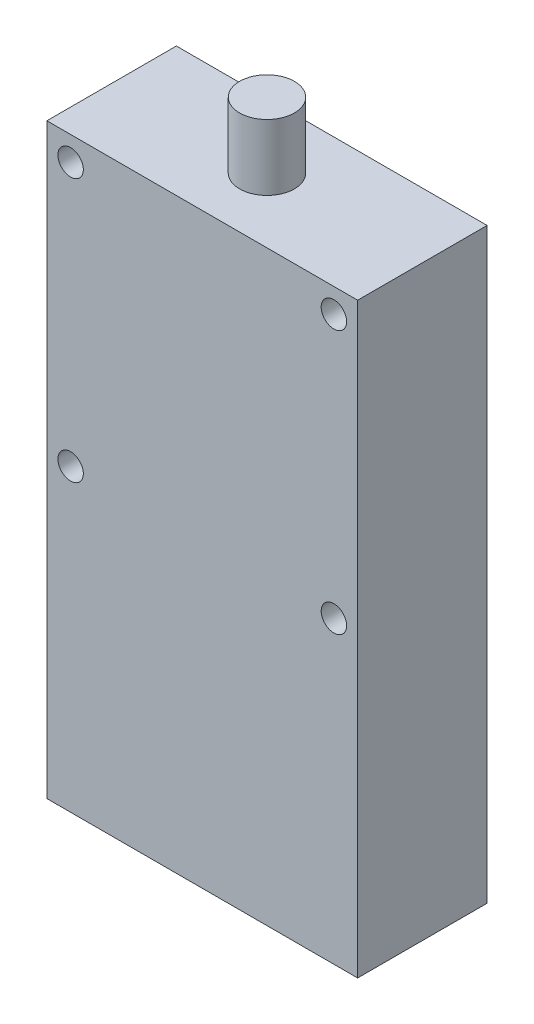
ISO-10303-21;
HEADER;
FILE_DESCRIPTION(('STEP AP214'),'2;1');
FILE_NAME('part.step','',(''),(''),'','','');
FILE_SCHEMA(('AUTOMOTIVE_DESIGN { 1 0 10303 214 1 1 1 1 }'));
ENDSEC;
DATA;
#1=APPLICATION_CONTEXT('core data for automotive mechanical design processes');
#2=APPLICATION_PROTOCOL_DEFINITION('international standard','automotive_design',2000,#1);
#3=PRODUCT_CONTEXT('',#1,'mechanical');
#4=PRODUCT('Part','Part','',(#3));
#5=PRODUCT_RELATED_PRODUCT_CATEGORY('part','',(#4));
#6=PRODUCT_DEFINITION_FORMATION('','',#4);
#7=PRODUCT_DEFINITION_CONTEXT('part definition',#1,'design');
#8=PRODUCT_DEFINITION('design','',#6,#7);
#9=PRODUCT_DEFINITION_SHAPE('','',#8);
#10=(LENGTH_UNIT() NAMED_UNIT(*) SI_UNIT(.MILLI.,.METRE.));
#11=(NAMED_UNIT(*) PLANE_ANGLE_UNIT() SI_UNIT($,.RADIAN.));
#12=(NAMED_UNIT(*) SI_UNIT($,.STERADIAN.) SOLID_ANGLE_UNIT());
#13=UNCERTAINTY_MEASURE_WITH_UNIT(LENGTH_MEASURE(1.E-05),#10,'distance_accuracy_value','');
#14=(GEOMETRIC_REPRESENTATION_CONTEXT(3) GLOBAL_UNCERTAINTY_ASSIGNED_CONTEXT((#13)) GLOBAL_UNIT_ASSIGNED_CONTEXT((#10,
#11,#12)) REPRESENTATION_CONTEXT('',''));
#15=CARTESIAN_POINT('',(0.,0.,0.));
#16=DIRECTION('',(0.,0.,1.));
#17=DIRECTION('',(1.,0.,0.));
#18=AXIS2_PLACEMENT_3D('',#15,#16,#17);
#19=CARTESIAN_POINT('',(-18.,34.,15.));
#20=DIRECTION('',(1.,0.,0.));
#21=DIRECTION('',(0.,0.,-1.));
#22=AXIS2_PLACEMENT_3D('',#19,#20,#21);
#23=PLANE('',#22);
#24=DIRECTION('',(0.,-1.,0.));
#25=VECTOR('',#24,1.);
#26=CARTESIAN_POINT('',(-18.,34.,0.));
#27=LINE('',#26,#25);
#28=CARTESIAN_POINT('',(-18.,34.,0.));
#29=VERTEX_POINT('',#28);
#30=CARTESIAN_POINT('',(-18.,-34.,0.));
#31=VERTEX_POINT('',#30);
#32=EDGE_CURVE('E117',#29,#31,#27,.T.);
#33=ORIENTED_EDGE('',*,*,#32,.T.);
#34=DIRECTION('',(0.,0.,-1.));
#35=VECTOR('',#34,1.);
#36=CARTESIAN_POINT('',(-18.,-34.,15.));
#37=LINE('',#36,#35);
#38=CARTESIAN_POINT('',(-18.,-34.,15.));
#39=VERTEX_POINT('',#38);
#40=EDGE_CURVE('E48',#39,#31,#37,.T.);
#41=ORIENTED_EDGE('',*,*,#40,.F.);
#42=DIRECTION('',(0.,-1.,0.));
#43=VECTOR('',#42,1.);
#44=CARTESIAN_POINT('',(-18.,34.,15.));
#45=LINE('',#44,#43);
#46=CARTESIAN_POINT('',(-18.,34.,15.));
#47=VERTEX_POINT('',#46);
#48=EDGE_CURVE('E100',#47,#39,#45,.T.);
#49=ORIENTED_EDGE('',*,*,#48,.F.);
#50=DIRECTION('',(0.,0.,-1.));
#51=VECTOR('',#50,1.);
#52=CARTESIAN_POINT('',(-18.,34.,15.));
#53=LINE('',#52,#51);
#54=EDGE_CURVE('E64',#47,#29,#53,.T.);
#55=ORIENTED_EDGE('',*,*,#54,.T.);
#56=EDGE_LOOP('',(#33,#41,#49,#55));
#57=FACE_BOUND('',#56,.T.);
#58=ADVANCED_FACE('F44',(#57),#23,.F.);
#59=CARTESIAN_POINT('',(-18.,-34.,15.));
#60=DIRECTION('',(0.,1.,0.));
#61=DIRECTION('',(-1.,0.,0.));
#62=AXIS2_PLACEMENT_3D('',#59,#60,#61);
#63=PLANE('',#62);
#64=DIRECTION('',(1.,0.,0.));
#65=VECTOR('',#64,1.);
#66=CARTESIAN_POINT('',(-18.,-34.,0.));
#67=LINE('',#66,#65);
#68=CARTESIAN_POINT('',(18.,-34.,0.));
#69=VERTEX_POINT('',#68);
#70=EDGE_CURVE('E102',#31,#69,#67,.T.);
#71=ORIENTED_EDGE('',*,*,#70,.T.);
#72=DIRECTION('',(0.,0.,-1.));
#73=VECTOR('',#72,1.);
#74=CARTESIAN_POINT('',(18.,-34.,15.));
#75=LINE('',#74,#73);
#76=CARTESIAN_POINT('',(18.,-34.,15.));
#77=VERTEX_POINT('',#76);
#78=EDGE_CURVE('E105',#77,#69,#75,.T.);
#79=ORIENTED_EDGE('',*,*,#78,.F.);
#80=DIRECTION('',(1.,0.,0.));
#81=VECTOR('',#80,1.);
#82=CARTESIAN_POINT('',(-18.,-34.,15.));
#83=LINE('',#82,#81);
#84=EDGE_CURVE('E90',#39,#77,#83,.T.);
#85=ORIENTED_EDGE('',*,*,#84,.F.);
#86=ORIENTED_EDGE('',*,*,#40,.T.);
#87=EDGE_LOOP('',(#71,#79,#85,#86));
#88=FACE_BOUND('',#87,.T.);
#89=ADVANCED_FACE('F103',(#88),#63,.F.);
#90=CARTESIAN_POINT('',(18.,34.,15.));
#91=DIRECTION('',(1.,0.,0.));
#92=DIRECTION('',(0.,0.,-1.));
#93=AXIS2_PLACEMENT_3D('',#90,#91,#92);
#94=PLANE('',#93);
#95=DIRECTION('',(0.,-1.,0.));
#96=VECTOR('',#95,1.);
#97=CARTESIAN_POINT('',(18.,34.,0.));
#98=LINE('',#97,#96);
#99=CARTESIAN_POINT('',(18.,34.,0.));
#100=VERTEX_POINT('',#99);
#101=EDGE_CURVE('E125',#100,#69,#98,.T.);
#102=ORIENTED_EDGE('',*,*,#101,.F.);
#103=DIRECTION('',(0.,0.,-1.));
#104=VECTOR('',#103,1.);
#105=CARTESIAN_POINT('',(18.,34.,15.));
#106=LINE('',#105,#104);
#107=CARTESIAN_POINT('',(18.,34.,15.));
#108=VERTEX_POINT('',#107);
#109=EDGE_CURVE('E80',#108,#100,#106,.T.);
#110=ORIENTED_EDGE('',*,*,#109,.F.);
#111=DIRECTION('',(0.,-1.,0.));
#112=VECTOR('',#111,1.);
#113=CARTESIAN_POINT('',(18.,34.,15.));
#114=LINE('',#113,#112);
#115=EDGE_CURVE('E96',#108,#77,#114,.T.);
#116=ORIENTED_EDGE('',*,*,#115,.T.);
#117=ORIENTED_EDGE('',*,*,#78,.T.);
#118=EDGE_LOOP('',(#102,#110,#116,#117));
#119=FACE_BOUND('',#118,.T.);
#120=ADVANCED_FACE('F107',(#119),#94,.T.);
#121=CARTESIAN_POINT('',(-18.,34.,15.));
#122=DIRECTION('',(0.,1.,0.));
#123=DIRECTION('',(-1.,0.,0.));
#124=AXIS2_PLACEMENT_3D('',#121,#122,#123);
#125=PLANE('',#124);
#126=CARTESIAN_POINT('',(0.,34.,7.5));
#127=DIRECTION('',(0.,1.,0.));
#128=DIRECTION('',(-1.,0.,0.));
#129=AXIS2_PLACEMENT_3D('',#126,#127,#128);
#130=CIRCLE('',#129,3.175);
#131=CARTESIAN_POINT('',(3.17499999999999,34.,7.5));
#132=VERTEX_POINT('',#131);
#133=EDGE_CURVE('E11',#132,#132,#130,.T.);
#134=ORIENTED_EDGE('',*,*,#133,.F.);
#135=EDGE_LOOP('',(#134));
#136=FACE_BOUND('',#135,.T.);
#137=DIRECTION('',(1.,0.,0.));
#138=VECTOR('',#137,1.);
#139=CARTESIAN_POINT('',(-18.,34.,0.));
#140=LINE('',#139,#138);
#141=EDGE_CURVE('E124',#29,#100,#140,.T.);
#142=ORIENTED_EDGE('',*,*,#141,.F.);
#143=ORIENTED_EDGE('',*,*,#54,.F.);
#144=DIRECTION('',(1.,0.,0.));
#145=VECTOR('',#144,1.);
#146=CARTESIAN_POINT('',(-18.,34.,15.));
#147=LINE('',#146,#145);
#148=EDGE_CURVE('E109',#47,#108,#147,.T.);
#149=ORIENTED_EDGE('',*,*,#148,.T.);
#150=ORIENTED_EDGE('',*,*,#109,.T.);
#151=EDGE_LOOP('',(#142,#143,#149,#150));
#152=FACE_BOUND('',#151,.T.);
#153=ADVANCED_FACE('F133',(#136,#152),#125,.T.);
#154=CARTESIAN_POINT('',(0.,0.,15.));
#155=DIRECTION('',(0.,0.,1.));
#156=DIRECTION('',(1.,0.,0.));
#157=AXIS2_PLACEMENT_3D('',#154,#155,#156);
#158=PLANE('',#157);
#159=CARTESIAN_POINT('',(-15.25,31.206,15.));
#160=DIRECTION('',(0.,0.,1.));
#161=DIRECTION('',(1.,0.,0.));
#162=AXIS2_PLACEMENT_3D('',#159,#160,#161);
#163=CIRCLE('',#162,1.47319999999999);
#164=CARTESIAN_POINT('',(-13.7768,31.206,15.));
#165=VERTEX_POINT('',#164);
#166=EDGE_CURVE('E234',#165,#165,#163,.T.);
#167=ORIENTED_EDGE('',*,*,#166,.F.);
#168=EDGE_LOOP('',(#167));
#169=FACE_BOUND('',#168,.T.);
#170=CARTESIAN_POINT('',(15.25,0.706000000000002,15.));
#171=DIRECTION('',(0.,0.,1.));
#172=DIRECTION('',(1.,0.,0.));
#173=AXIS2_PLACEMENT_3D('',#170,#171,#172);
#174=CIRCLE('',#173,1.47319999999999);
#175=CARTESIAN_POINT('',(16.7232,0.706000000000002,15.));
#176=VERTEX_POINT('',#175);
#177=EDGE_CURVE('E243',#176,#176,#174,.T.);
#178=ORIENTED_EDGE('',*,*,#177,.F.);
#179=EDGE_LOOP('',(#178));
#180=FACE_BOUND('',#179,.T.);
#181=CARTESIAN_POINT('',(-15.25,0.706000000000002,15.));
#182=DIRECTION('',(0.,0.,1.));
#183=DIRECTION('',(1.,0.,0.));
#184=AXIS2_PLACEMENT_3D('',#181,#182,#183);
#185=CIRCLE('',#184,1.47319999999999);
#186=CARTESIAN_POINT('',(-13.7768,0.706000000000002,15.));
#187=VERTEX_POINT('',#186);
#188=EDGE_CURVE('E251',#187,#187,#185,.T.);
#189=ORIENTED_EDGE('',*,*,#188,.F.);
#190=EDGE_LOOP('',(#189));
#191=FACE_BOUND('',#190,.T.);
#192=CARTESIAN_POINT('',(15.25,31.206,15.));
#193=DIRECTION('',(0.,0.,1.));
#194=DIRECTION('',(1.,0.,0.));
#195=AXIS2_PLACEMENT_3D('',#192,#193,#194);
#196=CIRCLE('',#195,1.47319999999999);
#197=CARTESIAN_POINT('',(16.7232,31.206,15.));
#198=VERTEX_POINT('',#197);
#199=EDGE_CURVE('E261',#198,#198,#196,.T.);
#200=ORIENTED_EDGE('',*,*,#199,.F.);
#201=EDGE_LOOP('',(#200));
#202=FACE_BOUND('',#201,.T.);
#203=ORIENTED_EDGE('',*,*,#48,.T.);
#204=ORIENTED_EDGE('',*,*,#84,.T.);
#205=ORIENTED_EDGE('',*,*,#115,.F.);
#206=ORIENTED_EDGE('',*,*,#148,.F.);
#207=EDGE_LOOP('',(#203,#204,#205,#206));
#208=FACE_BOUND('',#207,.T.);
#209=ADVANCED_FACE('F91',(#169,#180,#191,#202,#208),#158,.T.);
#210=CARTESIAN_POINT('',(0.,0.,0.));
#211=DIRECTION('',(0.,0.,1.));
#212=DIRECTION('',(1.,0.,0.));
#213=AXIS2_PLACEMENT_3D('',#210,#211,#212);
#214=PLANE('',#213);
#215=CARTESIAN_POINT('',(-15.25,31.206,0.));
#216=DIRECTION('',(0.,0.,1.));
#217=DIRECTION('',(1.,0.,0.));
#218=AXIS2_PLACEMENT_3D('',#215,#216,#217);
#219=CIRCLE('',#218,1.4732);
#220=CARTESIAN_POINT('',(-13.7768,31.206,0.));
#221=VERTEX_POINT('',#220);
#222=EDGE_CURVE('E239',#221,#221,#219,.T.);
#223=ORIENTED_EDGE('',*,*,#222,.T.);
#224=EDGE_LOOP('',(#223));
#225=FACE_BOUND('',#224,.T.);
#226=CARTESIAN_POINT('',(15.25,0.706000000000002,0.));
#227=DIRECTION('',(0.,0.,1.));
#228=DIRECTION('',(1.,0.,0.));
#229=AXIS2_PLACEMENT_3D('',#226,#227,#228);
#230=CIRCLE('',#229,1.4732);
#231=CARTESIAN_POINT('',(16.7232,0.706000000000002,0.));
#232=VERTEX_POINT('',#231);
#233=EDGE_CURVE('E247',#232,#232,#230,.T.);
#234=ORIENTED_EDGE('',*,*,#233,.T.);
#235=EDGE_LOOP('',(#234));
#236=FACE_BOUND('',#235,.T.);
#237=CARTESIAN_POINT('',(-15.25,0.706000000000002,0.));
#238=DIRECTION('',(0.,0.,1.));
#239=DIRECTION('',(1.,0.,0.));
#240=AXIS2_PLACEMENT_3D('',#237,#238,#239);
#241=CIRCLE('',#240,1.4732);
#242=CARTESIAN_POINT('',(-13.7768,0.706000000000002,0.));
#243=VERTEX_POINT('',#242);
#244=EDGE_CURVE('E260',#243,#243,#241,.T.);
#245=ORIENTED_EDGE('',*,*,#244,.T.);
#246=EDGE_LOOP('',(#245));
#247=FACE_BOUND('',#246,.T.);
#248=CARTESIAN_POINT('',(15.25,31.206,0.));
#249=DIRECTION('',(0.,0.,1.));
#250=DIRECTION('',(1.,0.,0.));
#251=AXIS2_PLACEMENT_3D('',#248,#249,#250);
#252=CIRCLE('',#251,1.4732);
#253=CARTESIAN_POINT('',(16.7232,31.206,0.));
#254=VERTEX_POINT('',#253);
#255=EDGE_CURVE('E116',#254,#254,#252,.T.);
#256=ORIENTED_EDGE('',*,*,#255,.T.);
#257=EDGE_LOOP('',(#256));
#258=FACE_BOUND('',#257,.T.);
#259=ORIENTED_EDGE('',*,*,#32,.F.);
#260=ORIENTED_EDGE('',*,*,#141,.T.);
#261=ORIENTED_EDGE('',*,*,#101,.T.);
#262=ORIENTED_EDGE('',*,*,#70,.F.);
#263=EDGE_LOOP('',(#259,#260,#261,#262));
#264=FACE_BOUND('',#263,.T.);
#265=ADVANCED_FACE('F131',(#225,#236,#247,#258,#264),#214,.F.);
#266=CARTESIAN_POINT('',(15.25,31.206,15.));
#267=DIRECTION('',(0.,0.,1.));
#268=DIRECTION('',(1.,0.,0.));
#269=AXIS2_PLACEMENT_3D('',#266,#267,#268);
#270=CYLINDRICAL_SURFACE('',#269,1.47319999999999);
#271=ORIENTED_EDGE('',*,*,#255,.F.);
#272=EDGE_LOOP('',(#271));
#273=FACE_BOUND('',#272,.T.);
#274=ORIENTED_EDGE('',*,*,#199,.T.);
#275=EDGE_LOOP('',(#274));
#276=FACE_BOUND('',#275,.T.);
#277=ADVANCED_FACE('F174',(#273,#276),#270,.F.);
#278=CARTESIAN_POINT('',(-15.25,0.706000000000002,15.));
#279=DIRECTION('',(0.,0.,1.));
#280=DIRECTION('',(1.,0.,0.));
#281=AXIS2_PLACEMENT_3D('',#278,#279,#280);
#282=CYLINDRICAL_SURFACE('',#281,1.47319999999999);
#283=ORIENTED_EDGE('',*,*,#244,.F.);
#284=EDGE_LOOP('',(#283));
#285=FACE_BOUND('',#284,.T.);
#286=ORIENTED_EDGE('',*,*,#188,.T.);
#287=EDGE_LOOP('',(#286));
#288=FACE_BOUND('',#287,.T.);
#289=ADVANCED_FACE('F182',(#285,#288),#282,.F.);
#290=CARTESIAN_POINT('',(15.25,0.706000000000002,15.));
#291=DIRECTION('',(0.,0.,1.));
#292=DIRECTION('',(1.,0.,0.));
#293=AXIS2_PLACEMENT_3D('',#290,#291,#292);
#294=CYLINDRICAL_SURFACE('',#293,1.47319999999999);
#295=ORIENTED_EDGE('',*,*,#233,.F.);
#296=EDGE_LOOP('',(#295));
#297=FACE_BOUND('',#296,.T.);
#298=ORIENTED_EDGE('',*,*,#177,.T.);
#299=EDGE_LOOP('',(#298));
#300=FACE_BOUND('',#299,.T.);
#301=ADVANCED_FACE('F188',(#297,#300),#294,.F.);
#302=CARTESIAN_POINT('',(-15.25,31.206,15.));
#303=DIRECTION('',(0.,0.,1.));
#304=DIRECTION('',(1.,0.,0.));
#305=AXIS2_PLACEMENT_3D('',#302,#303,#304);
#306=CYLINDRICAL_SURFACE('',#305,1.47319999999999);
#307=ORIENTED_EDGE('',*,*,#222,.F.);
#308=EDGE_LOOP('',(#307));
#309=FACE_BOUND('',#308,.T.);
#310=ORIENTED_EDGE('',*,*,#166,.T.);
#311=EDGE_LOOP('',(#310));
#312=FACE_BOUND('',#311,.T.);
#313=ADVANCED_FACE('F196',(#309,#312),#306,.F.);
#314=CARTESIAN_POINT('',(0.,41.62,7.5));
#315=DIRECTION('',(0.,-1.,0.));
#316=DIRECTION('',(1.,0.,0.));
#317=AXIS2_PLACEMENT_3D('',#314,#315,#316);
#318=CYLINDRICAL_SURFACE('',#317,3.175);
#319=CARTESIAN_POINT('',(0.,41.62,7.5));
#320=DIRECTION('',(0.,1.,0.));
#321=DIRECTION('',(-1.,0.,0.));
#322=AXIS2_PLACEMENT_3D('',#319,#320,#321);
#323=CIRCLE('',#322,3.175);
#324=CARTESIAN_POINT('',(3.17499999999999,41.62,7.5));
#325=VERTEX_POINT('',#324);
#326=EDGE_CURVE('E231',#325,#325,#323,.T.);
#327=CARTESIAN_POINT('',(3.17499999999999,41.62,7.5));
#328=CARTESIAN_POINT('',(3.17499999999999,41.540625,7.5));
#329=CARTESIAN_POINT('',(3.17499999999999,41.46125,7.5));
#330=CARTESIAN_POINT('',(3.17499999999999,41.3025,7.5));
#331=CARTESIAN_POINT('',(3.17499999999999,41.223125,7.5));
#332=CARTESIAN_POINT('',(3.17499999999999,41.064375,7.5));
#333=CARTESIAN_POINT('',(3.17499999999999,40.985,7.5));
#334=CARTESIAN_POINT('',(3.17499999999999,40.82625,7.5));
#335=CARTESIAN_POINT('',(3.17499999999999,40.746875,7.5));
#336=CARTESIAN_POINT('',(3.17499999999999,40.588125,7.5));
#337=CARTESIAN_POINT('',(3.17499999999999,40.50875,7.5));
#338=CARTESIAN_POINT('',(3.17499999999999,40.35,7.5));
#339=CARTESIAN_POINT('',(3.17499999999999,40.270625,7.5));
#340=CARTESIAN_POINT('',(3.17499999999999,40.111875,7.5));
#341=CARTESIAN_POINT('',(3.17499999999999,40.0325,7.5));
#342=CARTESIAN_POINT('',(3.17499999999999,39.87375,7.5));
#343=CARTESIAN_POINT('',(3.17499999999999,39.794375,7.5));
#344=CARTESIAN_POINT('',(3.17499999999999,39.635625,7.5));
#345=CARTESIAN_POINT('',(3.17499999999999,39.55625,7.5));
#346=CARTESIAN_POINT('',(3.17499999999999,39.3975,7.5));
#347=CARTESIAN_POINT('',(3.17499999999999,39.318125,7.5));
#348=CARTESIAN_POINT('',(3.17499999999999,39.159375,7.5));
#349=CARTESIAN_POINT('',(3.17499999999999,39.08,7.5));
#350=CARTESIAN_POINT('',(3.17499999999999,38.92125,7.5));
#351=CARTESIAN_POINT('',(3.17499999999999,38.841875,7.5));
#352=CARTESIAN_POINT('',(3.17499999999999,38.683125,7.5));
#353=CARTESIAN_POINT('',(3.17499999999999,38.60375,7.5));
#354=CARTESIAN_POINT('',(3.17499999999999,38.445,7.5));
#355=CARTESIAN_POINT('',(3.17499999999999,38.365625,7.5));
#356=CARTESIAN_POINT('',(3.17499999999999,38.206875,7.5));
#357=CARTESIAN_POINT('',(3.17499999999999,38.1275,7.5));
#358=CARTESIAN_POINT('',(3.17499999999999,37.96875,7.5));
#359=CARTESIAN_POINT('',(3.17499999999999,37.889375,7.5));
#360=CARTESIAN_POINT('',(3.17499999999999,37.730625,7.5));
#361=CARTESIAN_POINT('',(3.17499999999999,37.65125,7.5));
#362=CARTESIAN_POINT('',(3.17499999999999,37.4925,7.5));
#363=CARTESIAN_POINT('',(3.17499999999999,37.413125,7.5));
#364=CARTESIAN_POINT('',(3.17499999999999,37.254375,7.5));
#365=CARTESIAN_POINT('',(3.17499999999999,37.175,7.5));
#366=CARTESIAN_POINT('',(3.17499999999999,37.01625,7.5));
#367=CARTESIAN_POINT('',(3.17499999999999,36.936875,7.5));
#368=CARTESIAN_POINT('',(3.17499999999999,36.778125,7.5));
#369=CARTESIAN_POINT('',(3.17499999999999,36.69875,7.5));
#370=CARTESIAN_POINT('',(3.17499999999999,36.54,7.5));
#371=CARTESIAN_POINT('',(3.17499999999999,36.460625,7.5));
#372=CARTESIAN_POINT('',(3.17499999999999,36.301875,7.5));
#373=CARTESIAN_POINT('',(3.17499999999999,36.2225,7.5));
#374=CARTESIAN_POINT('',(3.17499999999999,36.06375,7.5));
#375=CARTESIAN_POINT('',(3.17499999999999,35.984375,7.5));
#376=CARTESIAN_POINT('',(3.17499999999999,35.825625,7.5));
#377=CARTESIAN_POINT('',(3.17499999999999,35.74625,7.5));
#378=CARTESIAN_POINT('',(3.17499999999999,35.5875,7.5));
#379=CARTESIAN_POINT('',(3.17499999999999,35.508125,7.5));
#380=CARTESIAN_POINT('',(3.17499999999999,35.349375,7.5));
#381=CARTESIAN_POINT('',(3.17499999999999,35.27,7.5));
#382=CARTESIAN_POINT('',(3.17499999999999,35.11125,7.5));
#383=CARTESIAN_POINT('',(3.17499999999999,35.031875,7.5));
#384=CARTESIAN_POINT('',(3.17499999999999,34.873125,7.5));
#385=CARTESIAN_POINT('',(3.17499999999999,34.79375,7.5));
#386=CARTESIAN_POINT('',(3.17499999999999,34.635,7.5));
#387=CARTESIAN_POINT('',(3.17499999999999,34.555625,7.5));
#388=CARTESIAN_POINT('',(3.17499999999999,34.396875,7.5));
#389=CARTESIAN_POINT('',(3.17499999999999,34.3175,7.5));
#390=CARTESIAN_POINT('',(3.17499999999999,34.15875,7.5));
#391=CARTESIAN_POINT('',(3.17499999999999,34.079375,7.5));
#392=CARTESIAN_POINT('',(3.17499999999999,34.,7.5));
#393=B_SPLINE_CURVE_WITH_KNOTS('',3,(#327,#328,#329,#330,#331,#332,#333,#334,#335,#336,#337,
#338,#339,#340,#341,#342,#343,#344,#345,#346,#347,#348,#349,#350,#351,#352,#353,#354,#355,#356,
#357,#358,#359,#360,#361,#362,#363,#364,#365,#366,#367,#368,#369,#370,#371,#372,#373,#374,#375,
#376,#377,#378,#379,#380,#381,#382,#383,#384,#385,#386,#387,#388,#389,#390,#391,#392),
.UNSPECIFIED.,.F.,.F.,(4,2,2,2,2,2,2,2,2,2,2,2,2,2,2,2,2,2,2,2,2,2,2,2,2,2,2,2,2,2,2,2,4),(0.,
0.238124999999999,0.476249999999998,0.714374999999996,0.952499999999995,1.19062499999999,
1.42875,1.666875,1.905,2.143125,2.38124999999999,2.619375,2.8575,3.095625,3.33375,3.571875,3.81,
4.048125,4.28625,4.524375,4.7625,5.000625,5.23875,5.476875,5.715,5.953125,6.19125,6.429375,
6.6675,6.905625,7.14375,7.381875,7.62),.UNSPECIFIED.);
#394=EDGE_CURVE('BSEAM206',#325,#132,#393,.T.);
#395=ORIENTED_EDGE('',*,*,#326,.F.);
#396=ORIENTED_EDGE('',*,*,#133,.T.);
#397=ORIENTED_EDGE('',*,*,#394,.T.);
#398=ORIENTED_EDGE('',*,*,#394,.F.);
#399=EDGE_LOOP('',(#395,#397,#396,#398));
#400=FACE_BOUND('',#399,.T.);
#401=ADVANCED_FACE('F206',(#400),#318,.T.);
#402=CARTESIAN_POINT('',(0.,41.62,7.5));
#403=DIRECTION('',(0.,1.,0.));
#404=DIRECTION('',(-1.,0.,0.));
#405=AXIS2_PLACEMENT_3D('',#402,#403,#404);
#406=PLANE('',#405);
#407=ORIENTED_EDGE('',*,*,#326,.T.);
#408=EDGE_LOOP('',(#407));
#409=FACE_BOUND('',#408,.T.);
#410=ADVANCED_FACE('F217',(#409),#406,.T.);
#411=CLOSED_SHELL('',(#58,#89,#120,#153,#209,#265,#277,#289,#301,#313,#401,#410));
#412=MANIFOLD_SOLID_BREP('B2',#411);
#413=ADVANCED_BREP_SHAPE_REPRESENTATION('',(#18,#412),#14);
#414=SHAPE_DEFINITION_REPRESENTATION(#9,#413);
ENDSEC;
END-ISO-10303-21;
